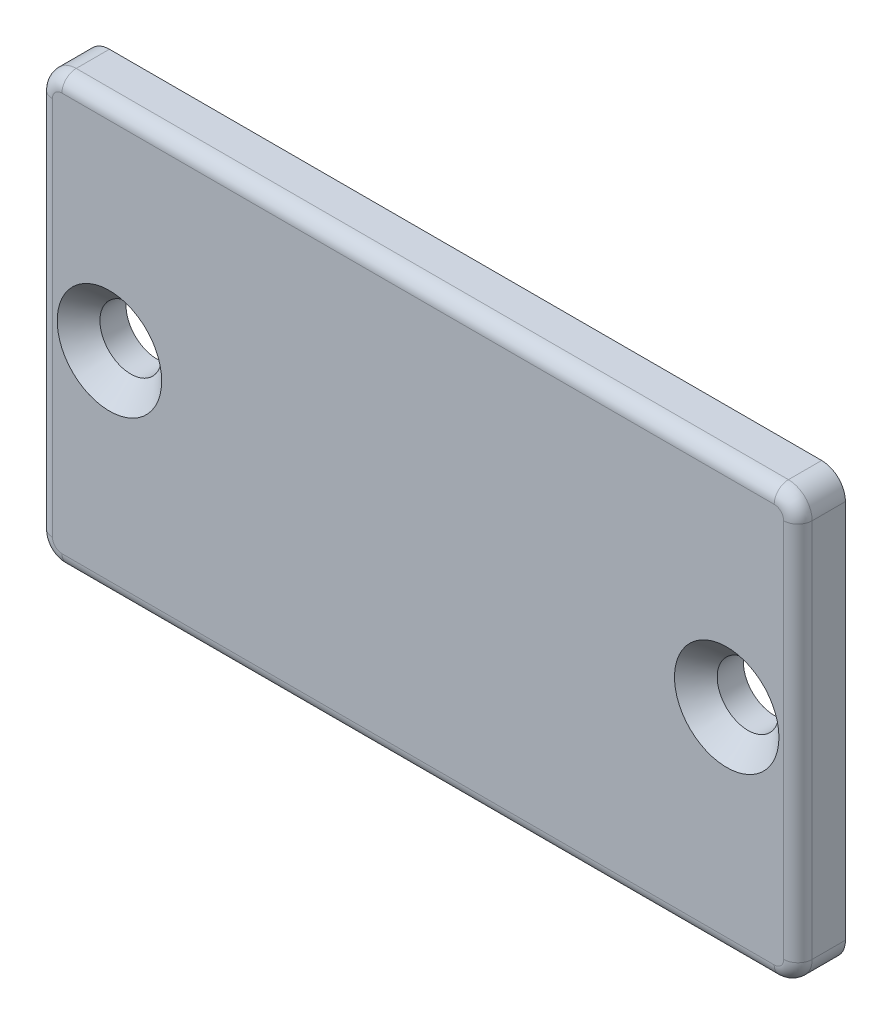
ISO-10303-21;
HEADER;
FILE_DESCRIPTION(('STEP AP214'),'2;1');
FILE_NAME('part.step','',(''),(''),'','','');
FILE_SCHEMA(('AUTOMOTIVE_DESIGN { 1 0 10303 214 1 1 1 1 }'));
ENDSEC;
DATA;
#1=APPLICATION_CONTEXT('core data for automotive mechanical design processes');
#2=APPLICATION_PROTOCOL_DEFINITION('international standard','automotive_design',2000,#1);
#3=PRODUCT_CONTEXT('',#1,'mechanical');
#4=PRODUCT('Part','Part','',(#3));
#5=PRODUCT_RELATED_PRODUCT_CATEGORY('part','',(#4));
#6=PRODUCT_DEFINITION_FORMATION('','',#4);
#7=PRODUCT_DEFINITION_CONTEXT('part definition',#1,'design');
#8=PRODUCT_DEFINITION('design','',#6,#7);
#9=PRODUCT_DEFINITION_SHAPE('','',#8);
#10=(LENGTH_UNIT() NAMED_UNIT(*) SI_UNIT(.MILLI.,.METRE.));
#11=(NAMED_UNIT(*) PLANE_ANGLE_UNIT() SI_UNIT($,.RADIAN.));
#12=(NAMED_UNIT(*) SI_UNIT($,.STERADIAN.) SOLID_ANGLE_UNIT());
#13=UNCERTAINTY_MEASURE_WITH_UNIT(LENGTH_MEASURE(1.E-05),#10,'distance_accuracy_value','');
#14=(GEOMETRIC_REPRESENTATION_CONTEXT(3) GLOBAL_UNCERTAINTY_ASSIGNED_CONTEXT((#13)) GLOBAL_UNIT_ASSIGNED_CONTEXT((#10,
#11,#12)) REPRESENTATION_CONTEXT('',''));
#15=CARTESIAN_POINT('',(0.,0.,0.));
#16=DIRECTION('',(0.,0.,1.));
#17=DIRECTION('',(1.,0.,0.));
#18=AXIS2_PLACEMENT_3D('',#15,#16,#17);
#19=CARTESIAN_POINT('',(16.,-9.,2.));
#20=DIRECTION('',(-1.,0.,0.));
#21=DIRECTION('',(0.,0.,1.));
#22=AXIS2_PLACEMENT_3D('',#19,#20,#21);
#23=PLANE('',#22);
#24=DIRECTION('',(0.,0.,-1.));
#25=VECTOR('',#24,1.);
#26=CARTESIAN_POINT('',(16.,8.,2.));
#27=LINE('',#26,#25);
#28=CARTESIAN_POINT('',(16.,8.,0.));
#29=VERTEX_POINT('',#28);
#30=CARTESIAN_POINT('',(16.,8.,1.4));
#31=VERTEX_POINT('',#30);
#32=EDGE_CURVE('E190',#29,#31,#27,.F.);
#33=ORIENTED_EDGE('',*,*,#32,.T.);
#34=DIRECTION('',(0.,1.,0.));
#35=VECTOR('',#34,1.);
#36=CARTESIAN_POINT('',(16.,-9.,1.4));
#37=LINE('',#36,#35);
#38=CARTESIAN_POINT('',(16.,-8.,1.4));
#39=VERTEX_POINT('',#38);
#40=EDGE_CURVE('E186',#31,#39,#37,.F.);
#41=ORIENTED_EDGE('',*,*,#40,.T.);
#42=DIRECTION('',(0.,0.,-1.));
#43=VECTOR('',#42,1.);
#44=CARTESIAN_POINT('',(16.,-8.,2.));
#45=LINE('',#44,#43);
#46=CARTESIAN_POINT('',(16.,-8.,0.));
#47=VERTEX_POINT('',#46);
#48=EDGE_CURVE('E179',#39,#47,#45,.T.);
#49=ORIENTED_EDGE('',*,*,#48,.T.);
#50=DIRECTION('',(0.,1.,0.));
#51=VECTOR('',#50,1.);
#52=CARTESIAN_POINT('',(16.,-9.,0.));
#53=LINE('',#52,#51);
#54=EDGE_CURVE('E183',#47,#29,#53,.T.);
#55=ORIENTED_EDGE('',*,*,#54,.T.);
#56=EDGE_LOOP('',(#33,#41,#49,#55));
#57=FACE_BOUND('',#56,.T.);
#58=ADVANCED_FACE('F41',(#57),#23,.F.);
#59=CARTESIAN_POINT('',(-16.,9.,2.));
#60=DIRECTION('',(0.,-1.,0.));
#61=DIRECTION('',(0.,0.,-1.));
#62=AXIS2_PLACEMENT_3D('',#59,#60,#61);
#63=PLANE('',#62);
#64=DIRECTION('',(0.,0.,-1.));
#65=VECTOR('',#64,1.);
#66=CARTESIAN_POINT('',(-15.,9.,2.));
#67=LINE('',#66,#65);
#68=CARTESIAN_POINT('',(-15.,9.,0.));
#69=VERTEX_POINT('',#68);
#70=CARTESIAN_POINT('',(-15.,9.,1.4));
#71=VERTEX_POINT('',#70);
#72=EDGE_CURVE('E237',#69,#71,#67,.F.);
#73=ORIENTED_EDGE('',*,*,#72,.T.);
#74=DIRECTION('',(-1.,0.,0.));
#75=VECTOR('',#74,1.);
#76=CARTESIAN_POINT('',(-16.,9.,1.4));
#77=LINE('',#76,#75);
#78=CARTESIAN_POINT('',(15.,9.,1.4));
#79=VERTEX_POINT('',#78);
#80=EDGE_CURVE('E264',#71,#79,#77,.F.);
#81=ORIENTED_EDGE('',*,*,#80,.T.);
#82=DIRECTION('',(0.,0.,-1.));
#83=VECTOR('',#82,1.);
#84=CARTESIAN_POINT('',(15.,9.,2.));
#85=LINE('',#84,#83);
#86=CARTESIAN_POINT('',(15.,9.,0.));
#87=VERTEX_POINT('',#86);
#88=EDGE_CURVE('E235',#79,#87,#85,.T.);
#89=ORIENTED_EDGE('',*,*,#88,.T.);
#90=DIRECTION('',(-1.,0.,0.));
#91=VECTOR('',#90,1.);
#92=CARTESIAN_POINT('',(-16.,9.,0.));
#93=LINE('',#92,#91);
#94=EDGE_CURVE('E206',#87,#69,#93,.T.);
#95=ORIENTED_EDGE('',*,*,#94,.T.);
#96=EDGE_LOOP('',(#73,#81,#89,#95));
#97=FACE_BOUND('',#96,.T.);
#98=ADVANCED_FACE('F404',(#97),#63,.F.);
#99=CARTESIAN_POINT('',(-16.,-9.,2.));
#100=DIRECTION('',(1.,0.,0.));
#101=DIRECTION('',(0.,0.,-1.));
#102=AXIS2_PLACEMENT_3D('',#99,#100,#101);
#103=PLANE('',#102);
#104=DIRECTION('',(0.,0.,-1.));
#105=VECTOR('',#104,1.);
#106=CARTESIAN_POINT('',(-16.,-8.,2.));
#107=LINE('',#106,#105);
#108=CARTESIAN_POINT('',(-16.,-8.,0.));
#109=VERTEX_POINT('',#108);
#110=CARTESIAN_POINT('',(-16.,-8.,1.4));
#111=VERTEX_POINT('',#110);
#112=EDGE_CURVE('E232',#109,#111,#107,.F.);
#113=ORIENTED_EDGE('',*,*,#112,.T.);
#114=DIRECTION('',(0.,-1.,0.));
#115=VECTOR('',#114,1.);
#116=CARTESIAN_POINT('',(-16.,-9.,1.4));
#117=LINE('',#116,#115);
#118=CARTESIAN_POINT('',(-16.,8.,1.4));
#119=VERTEX_POINT('',#118);
#120=EDGE_CURVE('E260',#111,#119,#117,.F.);
#121=ORIENTED_EDGE('',*,*,#120,.T.);
#122=DIRECTION('',(0.,0.,-1.));
#123=VECTOR('',#122,1.);
#124=CARTESIAN_POINT('',(-16.,8.,2.));
#125=LINE('',#124,#123);
#126=CARTESIAN_POINT('',(-16.,8.,0.));
#127=VERTEX_POINT('',#126);
#128=EDGE_CURVE('E230',#119,#127,#125,.T.);
#129=ORIENTED_EDGE('',*,*,#128,.T.);
#130=DIRECTION('',(0.,-1.,0.));
#131=VECTOR('',#130,1.);
#132=CARTESIAN_POINT('',(-16.,-9.,0.));
#133=LINE('',#132,#131);
#134=EDGE_CURVE('E210',#127,#109,#133,.T.);
#135=ORIENTED_EDGE('',*,*,#134,.T.);
#136=EDGE_LOOP('',(#113,#121,#129,#135));
#137=FACE_BOUND('',#136,.T.);
#138=ADVANCED_FACE('F409',(#137),#103,.F.);
#139=CARTESIAN_POINT('',(-16.,-9.,2.));
#140=DIRECTION('',(0.,1.,0.));
#141=DIRECTION('',(0.,0.,1.));
#142=AXIS2_PLACEMENT_3D('',#139,#140,#141);
#143=PLANE('',#142);
#144=DIRECTION('',(0.,0.,-1.));
#145=VECTOR('',#144,1.);
#146=CARTESIAN_POINT('',(15.,-9.,2.));
#147=LINE('',#146,#145);
#148=CARTESIAN_POINT('',(15.,-9.,0.));
#149=VERTEX_POINT('',#148);
#150=CARTESIAN_POINT('',(15.,-9.,1.4));
#151=VERTEX_POINT('',#150);
#152=EDGE_CURVE('E196',#149,#151,#147,.F.);
#153=ORIENTED_EDGE('',*,*,#152,.T.);
#154=DIRECTION('',(1.,0.,0.));
#155=VECTOR('',#154,1.);
#156=CARTESIAN_POINT('',(-16.,-9.,1.4));
#157=LINE('',#156,#155);
#158=CARTESIAN_POINT('',(-15.,-9.,1.4));
#159=VERTEX_POINT('',#158);
#160=EDGE_CURVE('E271',#151,#159,#157,.F.);
#161=ORIENTED_EDGE('',*,*,#160,.T.);
#162=DIRECTION('',(0.,0.,-1.));
#163=VECTOR('',#162,1.);
#164=CARTESIAN_POINT('',(-15.,-9.,2.));
#165=LINE('',#164,#163);
#166=CARTESIAN_POINT('',(-15.,-9.,0.));
#167=VERTEX_POINT('',#166);
#168=EDGE_CURVE('E200',#159,#167,#165,.T.);
#169=ORIENTED_EDGE('',*,*,#168,.T.);
#170=DIRECTION('',(1.,0.,0.));
#171=VECTOR('',#170,1.);
#172=CARTESIAN_POINT('',(-16.,-9.,0.));
#173=LINE('',#172,#171);
#174=EDGE_CURVE('E221',#167,#149,#173,.T.);
#175=ORIENTED_EDGE('',*,*,#174,.T.);
#176=EDGE_LOOP('',(#153,#161,#169,#175));
#177=FACE_BOUND('',#176,.T.);
#178=ADVANCED_FACE('F397',(#177),#143,.F.);
#179=CARTESIAN_POINT('',(0.,0.,2.));
#180=DIRECTION('',(0.,0.,-1.));
#181=DIRECTION('',(-1.,0.,0.));
#182=AXIS2_PLACEMENT_3D('',#179,#180,#181);
#183=PLANE('',#182);
#184=CARTESIAN_POINT('',(13.,0.,2.));
#185=DIRECTION('',(0.,0.,1.));
#186=DIRECTION('',(1.,0.,0.));
#187=AXIS2_PLACEMENT_3D('',#184,#185,#186);
#188=CIRCLE('',#187,2.2);
#189=CARTESIAN_POINT('',(15.2,0.,2.));
#190=VERTEX_POINT('',#189);
#191=EDGE_CURVE('E564',#190,#190,#188,.T.);
#192=ORIENTED_EDGE('',*,*,#191,.F.);
#193=EDGE_LOOP('',(#192));
#194=FACE_BOUND('',#193,.T.);
#195=CARTESIAN_POINT('',(-13.,0.,2.));
#196=DIRECTION('',(0.,0.,1.));
#197=DIRECTION('',(1.,0.,0.));
#198=AXIS2_PLACEMENT_3D('',#195,#196,#197);
#199=CIRCLE('',#198,2.2);
#200=CARTESIAN_POINT('',(-10.8,0.,2.));
#201=VERTEX_POINT('',#200);
#202=EDGE_CURVE('E333',#201,#201,#199,.T.);
#203=ORIENTED_EDGE('',*,*,#202,.F.);
#204=EDGE_LOOP('',(#203));
#205=FACE_BOUND('',#204,.T.);
#206=DIRECTION('',(0.,-1.,0.));
#207=VECTOR('',#206,1.);
#208=CARTESIAN_POINT('',(-15.4,0.,2.));
#209=LINE('',#208,#207);
#210=CARTESIAN_POINT('',(-15.4,8.,2.));
#211=VERTEX_POINT('',#210);
#212=CARTESIAN_POINT('',(-15.4,-8.,2.));
#213=VERTEX_POINT('',#212);
#214=EDGE_CURVE('E252',#211,#213,#209,.T.);
#215=ORIENTED_EDGE('',*,*,#214,.T.);
#216=CARTESIAN_POINT('',(-15.,-8.,2.));
#217=DIRECTION('',(0.,0.,-1.));
#218=DIRECTION('',(-1.,0.,0.));
#219=AXIS2_PLACEMENT_3D('',#216,#217,#218);
#220=CIRCLE('',#219,0.4);
#221=CARTESIAN_POINT('',(-15.,-8.4,2.));
#222=VERTEX_POINT('',#221);
#223=EDGE_CURVE('E254',#213,#222,#220,.F.);
#224=ORIENTED_EDGE('',*,*,#223,.T.);
#225=DIRECTION('',(1.,0.,0.));
#226=VECTOR('',#225,1.);
#227=CARTESIAN_POINT('',(0.,-8.4,2.));
#228=LINE('',#227,#226);
#229=CARTESIAN_POINT('',(15.,-8.4,2.));
#230=VERTEX_POINT('',#229);
#231=EDGE_CURVE('E240',#222,#230,#228,.T.);
#232=ORIENTED_EDGE('',*,*,#231,.T.);
#233=CARTESIAN_POINT('',(15.,-8.,2.));
#234=DIRECTION('',(0.,0.,-1.));
#235=DIRECTION('',(-1.,0.,0.));
#236=AXIS2_PLACEMENT_3D('',#233,#234,#235);
#237=CIRCLE('',#236,0.4);
#238=CARTESIAN_POINT('',(15.4,-8.,2.));
#239=VERTEX_POINT('',#238);
#240=EDGE_CURVE('E242',#230,#239,#237,.F.);
#241=ORIENTED_EDGE('',*,*,#240,.T.);
#242=DIRECTION('',(0.,1.,0.));
#243=VECTOR('',#242,1.);
#244=CARTESIAN_POINT('',(15.4,0.,2.));
#245=LINE('',#244,#243);
#246=CARTESIAN_POINT('',(15.4,8.,2.));
#247=VERTEX_POINT('',#246);
#248=EDGE_CURVE('E244',#239,#247,#245,.T.);
#249=ORIENTED_EDGE('',*,*,#248,.T.);
#250=CARTESIAN_POINT('',(15.,8.,2.));
#251=DIRECTION('',(0.,0.,-1.));
#252=DIRECTION('',(-1.,0.,0.));
#253=AXIS2_PLACEMENT_3D('',#250,#251,#252);
#254=CIRCLE('',#253,0.4);
#255=CARTESIAN_POINT('',(15.,8.4,2.));
#256=VERTEX_POINT('',#255);
#257=EDGE_CURVE('E246',#247,#256,#254,.F.);
#258=ORIENTED_EDGE('',*,*,#257,.T.);
#259=DIRECTION('',(-1.,0.,0.));
#260=VECTOR('',#259,1.);
#261=CARTESIAN_POINT('',(0.,8.4,2.));
#262=LINE('',#261,#260);
#263=CARTESIAN_POINT('',(-15.,8.4,2.));
#264=VERTEX_POINT('',#263);
#265=EDGE_CURVE('E248',#256,#264,#262,.T.);
#266=ORIENTED_EDGE('',*,*,#265,.T.);
#267=CARTESIAN_POINT('',(-15.,8.,2.));
#268=DIRECTION('',(0.,0.,-1.));
#269=DIRECTION('',(-1.,0.,0.));
#270=AXIS2_PLACEMENT_3D('',#267,#268,#269);
#271=CIRCLE('',#270,0.4);
#272=EDGE_CURVE('E250',#264,#211,#271,.F.);
#273=ORIENTED_EDGE('',*,*,#272,.T.);
#274=EDGE_LOOP('',(#215,#224,#232,#241,#249,#258,#266,#273));
#275=FACE_BOUND('',#274,.T.);
#276=ADVANCED_FACE('F388',(#194,#205,#275),#183,.F.);
#277=CARTESIAN_POINT('',(0.,0.,0.));
#278=DIRECTION('',(0.,0.,-1.));
#279=DIRECTION('',(-1.,0.,0.));
#280=AXIS2_PLACEMENT_3D('',#277,#278,#279);
#281=PLANE('',#280);
#282=CARTESIAN_POINT('',(13.,0.,0.));
#283=DIRECTION('',(0.,0.,-1.));
#284=DIRECTION('',(-1.,0.,0.));
#285=AXIS2_PLACEMENT_3D('',#282,#283,#284);
#286=CIRCLE('',#285,1.3);
#287=CARTESIAN_POINT('',(11.7,0.,0.));
#288=VERTEX_POINT('',#287);
#289=EDGE_CURVE('E45',#288,#288,#286,.T.);
#290=ORIENTED_EDGE('',*,*,#289,.F.);
#291=EDGE_LOOP('',(#290));
#292=FACE_BOUND('',#291,.T.);
#293=CARTESIAN_POINT('',(-13.,0.,0.));
#294=DIRECTION('',(0.,0.,-1.));
#295=DIRECTION('',(-1.,0.,0.));
#296=AXIS2_PLACEMENT_3D('',#293,#294,#295);
#297=CIRCLE('',#296,1.3);
#298=CARTESIAN_POINT('',(-14.3,0.,0.));
#299=VERTEX_POINT('',#298);
#300=EDGE_CURVE('E277',#299,#299,#297,.T.);
#301=ORIENTED_EDGE('',*,*,#300,.F.);
#302=EDGE_LOOP('',(#301));
#303=FACE_BOUND('',#302,.T.);
#304=DIRECTION('',(0.,1.,0.));
#305=VECTOR('',#304,1.);
#306=CARTESIAN_POINT('',(-9.5,-6.,0.));
#307=LINE('',#306,#305);
#308=CARTESIAN_POINT('',(-9.5,-5.,0.));
#309=VERTEX_POINT('',#308);
#310=CARTESIAN_POINT('',(-9.5,5.,0.));
#311=VERTEX_POINT('',#310);
#312=EDGE_CURVE('E297',#309,#311,#307,.T.);
#313=ORIENTED_EDGE('',*,*,#312,.F.);
#314=CARTESIAN_POINT('',(-8.5,-5.,0.));
#315=DIRECTION('',(0.,0.,-1.));
#316=DIRECTION('',(-1.,0.,0.));
#317=AXIS2_PLACEMENT_3D('',#314,#315,#316);
#318=CIRCLE('',#317,1.);
#319=CARTESIAN_POINT('',(-8.5,-6.,0.));
#320=VERTEX_POINT('',#319);
#321=EDGE_CURVE('E326',#309,#320,#318,.F.);
#322=ORIENTED_EDGE('',*,*,#321,.T.);
#323=DIRECTION('',(-1.,0.,0.));
#324=VECTOR('',#323,1.);
#325=CARTESIAN_POINT('',(9.5,-6.,0.));
#326=LINE('',#325,#324);
#327=CARTESIAN_POINT('',(8.5,-6.,0.));
#328=VERTEX_POINT('',#327);
#329=EDGE_CURVE('E216',#328,#320,#326,.T.);
#330=ORIENTED_EDGE('',*,*,#329,.F.);
#331=CARTESIAN_POINT('',(8.5,-5.,0.));
#332=DIRECTION('',(0.,0.,-1.));
#333=DIRECTION('',(-1.,0.,0.));
#334=AXIS2_PLACEMENT_3D('',#331,#332,#333);
#335=CIRCLE('',#334,1.);
#336=CARTESIAN_POINT('',(9.5,-5.,0.));
#337=VERTEX_POINT('',#336);
#338=EDGE_CURVE('E324',#328,#337,#335,.F.);
#339=ORIENTED_EDGE('',*,*,#338,.T.);
#340=DIRECTION('',(0.,-1.,0.));
#341=VECTOR('',#340,1.);
#342=CARTESIAN_POINT('',(9.5,-6.,0.));
#343=LINE('',#342,#341);
#344=CARTESIAN_POINT('',(9.5,5.,0.));
#345=VERTEX_POINT('',#344);
#346=EDGE_CURVE('E352',#345,#337,#343,.T.);
#347=ORIENTED_EDGE('',*,*,#346,.F.);
#348=CARTESIAN_POINT('',(8.5,5.,0.));
#349=DIRECTION('',(0.,0.,-1.));
#350=DIRECTION('',(-1.,0.,0.));
#351=AXIS2_PLACEMENT_3D('',#348,#349,#350);
#352=CIRCLE('',#351,1.);
#353=CARTESIAN_POINT('',(8.5,6.,0.));
#354=VERTEX_POINT('',#353);
#355=EDGE_CURVE('E11',#345,#354,#352,.F.);
#356=ORIENTED_EDGE('',*,*,#355,.T.);
#357=DIRECTION('',(1.,0.,0.));
#358=VECTOR('',#357,1.);
#359=CARTESIAN_POINT('',(9.5,6.,0.));
#360=LINE('',#359,#358);
#361=CARTESIAN_POINT('',(-8.5,6.,0.));
#362=VERTEX_POINT('',#361);
#363=EDGE_CURVE('E351',#362,#354,#360,.T.);
#364=ORIENTED_EDGE('',*,*,#363,.F.);
#365=CARTESIAN_POINT('',(-8.5,5.,0.));
#366=DIRECTION('',(0.,0.,-1.));
#367=DIRECTION('',(-1.,0.,0.));
#368=AXIS2_PLACEMENT_3D('',#365,#366,#367);
#369=CIRCLE('',#368,1.);
#370=EDGE_CURVE('E50',#362,#311,#369,.F.);
#371=ORIENTED_EDGE('',*,*,#370,.T.);
#372=EDGE_LOOP('',(#313,#322,#330,#339,#347,#356,#364,#371));
#373=FACE_BOUND('',#372,.T.);
#374=ORIENTED_EDGE('',*,*,#54,.F.);
#375=CARTESIAN_POINT('',(15.,-8.,0.));
#376=DIRECTION('',(0.,0.,-1.));
#377=DIRECTION('',(-1.,0.,0.));
#378=AXIS2_PLACEMENT_3D('',#375,#376,#377);
#379=CIRCLE('',#378,1.);
#380=EDGE_CURVE('E193',#47,#149,#379,.T.);
#381=ORIENTED_EDGE('',*,*,#380,.T.);
#382=ORIENTED_EDGE('',*,*,#174,.F.);
#383=CARTESIAN_POINT('',(-15.,-8.,0.));
#384=DIRECTION('',(0.,0.,-1.));
#385=DIRECTION('',(-1.,0.,0.));
#386=AXIS2_PLACEMENT_3D('',#383,#384,#385);
#387=CIRCLE('',#386,1.);
#388=EDGE_CURVE('E201',#167,#109,#387,.T.);
#389=ORIENTED_EDGE('',*,*,#388,.T.);
#390=ORIENTED_EDGE('',*,*,#134,.F.);
#391=CARTESIAN_POINT('',(-15.,8.,0.));
#392=DIRECTION('',(0.,0.,-1.));
#393=DIRECTION('',(-1.,0.,0.));
#394=AXIS2_PLACEMENT_3D('',#391,#392,#393);
#395=CIRCLE('',#394,1.);
#396=EDGE_CURVE('E225',#127,#69,#395,.T.);
#397=ORIENTED_EDGE('',*,*,#396,.T.);
#398=ORIENTED_EDGE('',*,*,#94,.F.);
#399=CARTESIAN_POINT('',(15.,8.,0.));
#400=DIRECTION('',(0.,0.,-1.));
#401=DIRECTION('',(-1.,0.,0.));
#402=AXIS2_PLACEMENT_3D('',#399,#400,#401);
#403=CIRCLE('',#402,1.);
#404=EDGE_CURVE('E189',#87,#29,#403,.T.);
#405=ORIENTED_EDGE('',*,*,#404,.T.);
#406=EDGE_LOOP('',(#374,#381,#382,#389,#390,#397,#398,#405));
#407=FACE_BOUND('',#406,.T.);
#408=ADVANCED_FACE('F203',(#292,#303,#373,#407),#281,.T.);
#409=CARTESIAN_POINT('',(-9.5,-6.,-1.4));
#410=DIRECTION('',(1.,0.,0.));
#411=DIRECTION('',(0.,0.,-1.));
#412=AXIS2_PLACEMENT_3D('',#409,#410,#411);
#413=PLANE('',#412);
#414=DIRECTION('',(0.,1.,0.));
#415=VECTOR('',#414,1.);
#416=CARTESIAN_POINT('',(-9.5,-6.,-1.4));
#417=LINE('',#416,#415);
#418=CARTESIAN_POINT('',(-9.5,-5.,-1.4));
#419=VERTEX_POINT('',#418);
#420=CARTESIAN_POINT('',(-9.5,5.,-1.4));
#421=VERTEX_POINT('',#420);
#422=EDGE_CURVE('E341',#419,#421,#417,.T.);
#423=ORIENTED_EDGE('',*,*,#422,.F.);
#424=DIRECTION('',(0.,0.,1.));
#425=VECTOR('',#424,1.);
#426=CARTESIAN_POINT('',(-9.5,-5.,-1.4));
#427=LINE('',#426,#425);
#428=EDGE_CURVE('E317',#419,#309,#427,.T.);
#429=ORIENTED_EDGE('',*,*,#428,.T.);
#430=ORIENTED_EDGE('',*,*,#312,.T.);
#431=DIRECTION('',(0.,0.,1.));
#432=VECTOR('',#431,1.);
#433=CARTESIAN_POINT('',(-9.5,5.,-1.4));
#434=LINE('',#433,#432);
#435=EDGE_CURVE('E315',#311,#421,#434,.F.);
#436=ORIENTED_EDGE('',*,*,#435,.T.);
#437=EDGE_LOOP('',(#423,#429,#430,#436));
#438=FACE_BOUND('',#437,.T.);
#439=ADVANCED_FACE('F372',(#438),#413,.F.);
#440=CARTESIAN_POINT('',(9.5,6.,-1.4));
#441=DIRECTION('',(0.,-1.,0.));
#442=DIRECTION('',(0.,0.,-1.));
#443=AXIS2_PLACEMENT_3D('',#440,#441,#442);
#444=PLANE('',#443);
#445=DIRECTION('',(1.,0.,0.));
#446=VECTOR('',#445,1.);
#447=CARTESIAN_POINT('',(9.5,6.,-1.4));
#448=LINE('',#447,#446);
#449=CARTESIAN_POINT('',(-8.5,6.,-1.4));
#450=VERTEX_POINT('',#449);
#451=CARTESIAN_POINT('',(8.5,6.,-1.4));
#452=VERTEX_POINT('',#451);
#453=EDGE_CURVE('E344',#450,#452,#448,.T.);
#454=ORIENTED_EDGE('',*,*,#453,.F.);
#455=DIRECTION('',(0.,0.,1.));
#456=VECTOR('',#455,1.);
#457=CARTESIAN_POINT('',(-8.5,6.,-1.4));
#458=LINE('',#457,#456);
#459=EDGE_CURVE('E322',#450,#362,#458,.T.);
#460=ORIENTED_EDGE('',*,*,#459,.T.);
#461=ORIENTED_EDGE('',*,*,#363,.T.);
#462=DIRECTION('',(0.,0.,1.));
#463=VECTOR('',#462,1.);
#464=CARTESIAN_POINT('',(8.5,6.,-1.4));
#465=LINE('',#464,#463);
#466=EDGE_CURVE('E320',#354,#452,#465,.F.);
#467=ORIENTED_EDGE('',*,*,#466,.T.);
#468=EDGE_LOOP('',(#454,#460,#461,#467));
#469=FACE_BOUND('',#468,.T.);
#470=ADVANCED_FACE('F378',(#469),#444,.F.);
#471=CARTESIAN_POINT('',(9.5,-6.,-1.4));
#472=DIRECTION('',(-1.,0.,0.));
#473=DIRECTION('',(0.,0.,1.));
#474=AXIS2_PLACEMENT_3D('',#471,#472,#473);
#475=PLANE('',#474);
#476=ORIENTED_EDGE('',*,*,#346,.T.);
#477=DIRECTION('',(0.,0.,1.));
#478=VECTOR('',#477,1.);
#479=CARTESIAN_POINT('',(9.5,-5.,-1.4));
#480=LINE('',#479,#478);
#481=CARTESIAN_POINT('',(9.5,-5.,-1.4));
#482=VERTEX_POINT('',#481);
#483=EDGE_CURVE('E305',#337,#482,#480,.F.);
#484=ORIENTED_EDGE('',*,*,#483,.T.);
#485=DIRECTION('',(0.,-1.,0.));
#486=VECTOR('',#485,1.);
#487=CARTESIAN_POINT('',(9.5,-6.,-1.4));
#488=LINE('',#487,#486);
#489=CARTESIAN_POINT('',(9.5,5.,-1.4));
#490=VERTEX_POINT('',#489);
#491=EDGE_CURVE('E213',#490,#482,#488,.T.);
#492=ORIENTED_EDGE('',*,*,#491,.F.);
#493=DIRECTION('',(0.,0.,1.));
#494=VECTOR('',#493,1.);
#495=CARTESIAN_POINT('',(9.5,5.,-1.4));
#496=LINE('',#495,#494);
#497=EDGE_CURVE('E302',#490,#345,#496,.T.);
#498=ORIENTED_EDGE('',*,*,#497,.T.);
#499=EDGE_LOOP('',(#476,#484,#492,#498));
#500=FACE_BOUND('',#499,.T.);
#501=ADVANCED_FACE('F384',(#500),#475,.F.);
#502=CARTESIAN_POINT('',(9.5,-6.,-1.4));
#503=DIRECTION('',(0.,1.,0.));
#504=DIRECTION('',(0.,0.,1.));
#505=AXIS2_PLACEMENT_3D('',#502,#503,#504);
#506=PLANE('',#505);
#507=DIRECTION('',(-1.,0.,0.));
#508=VECTOR('',#507,1.);
#509=CARTESIAN_POINT('',(9.5,-6.,-1.4));
#510=LINE('',#509,#508);
#511=CARTESIAN_POINT('',(8.5,-6.,-1.4));
#512=VERTEX_POINT('',#511);
#513=CARTESIAN_POINT('',(-8.5,-6.,-1.4));
#514=VERTEX_POINT('',#513);
#515=EDGE_CURVE('E207',#512,#514,#510,.T.);
#516=ORIENTED_EDGE('',*,*,#515,.F.);
#517=DIRECTION('',(0.,0.,1.));
#518=VECTOR('',#517,1.);
#519=CARTESIAN_POINT('',(8.5,-6.,-1.4));
#520=LINE('',#519,#518);
#521=EDGE_CURVE('E299',#512,#328,#520,.T.);
#522=ORIENTED_EDGE('',*,*,#521,.T.);
#523=ORIENTED_EDGE('',*,*,#329,.T.);
#524=DIRECTION('',(0.,0.,1.));
#525=VECTOR('',#524,1.);
#526=CARTESIAN_POINT('',(-8.5,-6.,-1.4));
#527=LINE('',#526,#525);
#528=EDGE_CURVE('E273',#320,#514,#527,.F.);
#529=ORIENTED_EDGE('',*,*,#528,.T.);
#530=EDGE_LOOP('',(#516,#522,#523,#529));
#531=FACE_BOUND('',#530,.T.);
#532=ADVANCED_FACE('F361',(#531),#506,.F.);
#533=CARTESIAN_POINT('',(0.,0.,-1.4));
#534=DIRECTION('',(0.,0.,1.));
#535=DIRECTION('',(1.,0.,0.));
#536=AXIS2_PLACEMENT_3D('',#533,#534,#535);
#537=PLANE('',#536);
#538=ORIENTED_EDGE('',*,*,#491,.T.);
#539=CARTESIAN_POINT('',(8.5,-5.,-1.4));
#540=DIRECTION('',(0.,0.,1.));
#541=DIRECTION('',(1.,0.,0.));
#542=AXIS2_PLACEMENT_3D('',#539,#540,#541);
#543=CIRCLE('',#542,1.);
#544=EDGE_CURVE('E313',#482,#512,#543,.F.);
#545=ORIENTED_EDGE('',*,*,#544,.T.);
#546=ORIENTED_EDGE('',*,*,#515,.T.);
#547=CARTESIAN_POINT('',(-8.5,-5.,-1.4));
#548=DIRECTION('',(0.,0.,1.));
#549=DIRECTION('',(1.,0.,0.));
#550=AXIS2_PLACEMENT_3D('',#547,#548,#549);
#551=CIRCLE('',#550,1.);
#552=EDGE_CURVE('E311',#514,#419,#551,.F.);
#553=ORIENTED_EDGE('',*,*,#552,.T.);
#554=ORIENTED_EDGE('',*,*,#422,.T.);
#555=CARTESIAN_POINT('',(-8.5,5.,-1.4));
#556=DIRECTION('',(0.,0.,1.));
#557=DIRECTION('',(1.,0.,0.));
#558=AXIS2_PLACEMENT_3D('',#555,#556,#557);
#559=CIRCLE('',#558,1.);
#560=EDGE_CURVE('E309',#421,#450,#559,.F.);
#561=ORIENTED_EDGE('',*,*,#560,.T.);
#562=ORIENTED_EDGE('',*,*,#453,.T.);
#563=CARTESIAN_POINT('',(8.5,5.,-1.4));
#564=DIRECTION('',(0.,0.,1.));
#565=DIRECTION('',(1.,0.,0.));
#566=AXIS2_PLACEMENT_3D('',#563,#564,#565);
#567=CIRCLE('',#566,1.);
#568=EDGE_CURVE('E307',#452,#490,#567,.F.);
#569=ORIENTED_EDGE('',*,*,#568,.T.);
#570=EDGE_LOOP('',(#538,#545,#546,#553,#554,#561,#562,#569));
#571=FACE_BOUND('',#570,.T.);
#572=ADVANCED_FACE('F369',(#571),#537,.F.);
#573=CARTESIAN_POINT('',(15.,-8.,2.));
#574=DIRECTION('',(0.,0.,-1.));
#575=DIRECTION('',(-1.,0.,0.));
#576=AXIS2_PLACEMENT_3D('',#573,#574,#575);
#577=CYLINDRICAL_SURFACE('',#576,1.);
#578=ORIENTED_EDGE('',*,*,#48,.F.);
#579=CARTESIAN_POINT('',(15.,-8.,1.4));
#580=DIRECTION('',(0.,0.,-1.));
#581=DIRECTION('',(-1.,0.,0.));
#582=AXIS2_PLACEMENT_3D('',#579,#580,#581);
#583=CIRCLE('',#582,1.);
#584=EDGE_CURVE('E269',#39,#151,#583,.T.);
#585=ORIENTED_EDGE('',*,*,#584,.T.);
#586=ORIENTED_EDGE('',*,*,#152,.F.);
#587=ORIENTED_EDGE('',*,*,#380,.F.);
#588=EDGE_LOOP('',(#578,#585,#586,#587));
#589=FACE_BOUND('',#588,.T.);
#590=ADVANCED_FACE('F194',(#589),#577,.T.);
#591=CARTESIAN_POINT('',(-15.,-8.,2.));
#592=DIRECTION('',(0.,0.,-1.));
#593=DIRECTION('',(-1.,0.,0.));
#594=AXIS2_PLACEMENT_3D('',#591,#592,#593);
#595=CYLINDRICAL_SURFACE('',#594,1.);
#596=ORIENTED_EDGE('',*,*,#168,.F.);
#597=CARTESIAN_POINT('',(-15.,-8.,1.4));
#598=DIRECTION('',(0.,0.,-1.));
#599=DIRECTION('',(-1.,0.,0.));
#600=AXIS2_PLACEMENT_3D('',#597,#598,#599);
#601=CIRCLE('',#600,1.);
#602=EDGE_CURVE('E257',#159,#111,#601,.T.);
#603=ORIENTED_EDGE('',*,*,#602,.T.);
#604=ORIENTED_EDGE('',*,*,#112,.F.);
#605=ORIENTED_EDGE('',*,*,#388,.F.);
#606=EDGE_LOOP('',(#596,#603,#604,#605));
#607=FACE_BOUND('',#606,.T.);
#608=ADVANCED_FACE('F416',(#607),#595,.T.);
#609=CARTESIAN_POINT('',(-15.,8.,2.));
#610=DIRECTION('',(0.,0.,-1.));
#611=DIRECTION('',(-1.,0.,0.));
#612=AXIS2_PLACEMENT_3D('',#609,#610,#611);
#613=CYLINDRICAL_SURFACE('',#612,1.);
#614=ORIENTED_EDGE('',*,*,#128,.F.);
#615=CARTESIAN_POINT('',(-15.,8.,1.4));
#616=DIRECTION('',(0.,0.,-1.));
#617=DIRECTION('',(-1.,0.,0.));
#618=AXIS2_PLACEMENT_3D('',#615,#616,#617);
#619=CIRCLE('',#618,1.);
#620=EDGE_CURVE('E262',#119,#71,#619,.T.);
#621=ORIENTED_EDGE('',*,*,#620,.T.);
#622=ORIENTED_EDGE('',*,*,#72,.F.);
#623=ORIENTED_EDGE('',*,*,#396,.F.);
#624=EDGE_LOOP('',(#614,#621,#622,#623));
#625=FACE_BOUND('',#624,.T.);
#626=ADVANCED_FACE('F419',(#625),#613,.T.);
#627=CARTESIAN_POINT('',(15.,8.,2.));
#628=DIRECTION('',(0.,0.,-1.));
#629=DIRECTION('',(-1.,0.,0.));
#630=AXIS2_PLACEMENT_3D('',#627,#628,#629);
#631=CYLINDRICAL_SURFACE('',#630,1.);
#632=ORIENTED_EDGE('',*,*,#88,.F.);
#633=CARTESIAN_POINT('',(15.,8.,1.4));
#634=DIRECTION('',(0.,0.,-1.));
#635=DIRECTION('',(-1.,0.,0.));
#636=AXIS2_PLACEMENT_3D('',#633,#634,#635);
#637=CIRCLE('',#636,1.);
#638=EDGE_CURVE('E266',#79,#31,#637,.T.);
#639=ORIENTED_EDGE('',*,*,#638,.T.);
#640=ORIENTED_EDGE('',*,*,#32,.F.);
#641=ORIENTED_EDGE('',*,*,#404,.F.);
#642=EDGE_LOOP('',(#632,#639,#640,#641));
#643=FACE_BOUND('',#642,.T.);
#644=ADVANCED_FACE('F423',(#643),#631,.T.);
#645=CARTESIAN_POINT('',(15.,8.,1.4));
#646=DIRECTION('',(0.,0.,-1.));
#647=DIRECTION('',(-1.,0.,0.));
#648=AXIS2_PLACEMENT_3D('',#645,#646,#647);
#649=DEGENERATE_TOROIDAL_SURFACE('',#648,0.4,0.6,.T.);
#650=CARTESIAN_POINT('',(15.4,8.,1.4));
#651=DIRECTION('',(0.,-1.,0.));
#652=DIRECTION('',(0.,0.,-1.));
#653=AXIS2_PLACEMENT_3D('',#650,#651,#652);
#654=CIRCLE('',#653,0.6);
#655=EDGE_CURVE('E291',#31,#247,#654,.T.);
#656=ORIENTED_EDGE('',*,*,#655,.F.);
#657=ORIENTED_EDGE('',*,*,#638,.F.);
#658=CARTESIAN_POINT('',(15.,8.4,1.4));
#659=DIRECTION('',(-1.,0.,0.));
#660=DIRECTION('',(0.,0.,1.));
#661=AXIS2_PLACEMENT_3D('',#658,#659,#660);
#662=CIRCLE('',#661,0.6);
#663=EDGE_CURVE('E294',#256,#79,#662,.T.);
#664=ORIENTED_EDGE('',*,*,#663,.F.);
#665=ORIENTED_EDGE('',*,*,#257,.F.);
#666=EDGE_LOOP('',(#656,#657,#664,#665));
#667=FACE_BOUND('',#666,.T.);
#668=ADVANCED_FACE('F427',(#667),#649,.T.);
#669=CARTESIAN_POINT('',(0.,8.4,1.4));
#670=DIRECTION('',(-1.,0.,0.));
#671=DIRECTION('',(0.,0.,1.));
#672=AXIS2_PLACEMENT_3D('',#669,#670,#671);
#673=CYLINDRICAL_SURFACE('',#672,0.6);
#674=ORIENTED_EDGE('',*,*,#663,.T.);
#675=ORIENTED_EDGE('',*,*,#80,.F.);
#676=CARTESIAN_POINT('',(-15.,8.4,1.4));
#677=DIRECTION('',(-1.,0.,0.));
#678=DIRECTION('',(0.,0.,1.));
#679=AXIS2_PLACEMENT_3D('',#676,#677,#678);
#680=CIRCLE('',#679,0.6);
#681=EDGE_CURVE('E288',#264,#71,#680,.T.);
#682=ORIENTED_EDGE('',*,*,#681,.F.);
#683=ORIENTED_EDGE('',*,*,#265,.F.);
#684=EDGE_LOOP('',(#674,#675,#682,#683));
#685=FACE_BOUND('',#684,.T.);
#686=ADVANCED_FACE('F452',(#685),#673,.T.);
#687=CARTESIAN_POINT('',(15.4,0.,1.4));
#688=DIRECTION('',(0.,1.,0.));
#689=DIRECTION('',(0.,0.,1.));
#690=AXIS2_PLACEMENT_3D('',#687,#688,#689);
#691=CYLINDRICAL_SURFACE('',#690,0.6);
#692=ORIENTED_EDGE('',*,*,#655,.T.);
#693=ORIENTED_EDGE('',*,*,#248,.F.);
#694=CARTESIAN_POINT('',(15.4,-8.,1.4));
#695=DIRECTION('',(0.,-1.,0.));
#696=DIRECTION('',(0.,0.,-1.));
#697=AXIS2_PLACEMENT_3D('',#694,#695,#696);
#698=CIRCLE('',#697,0.6);
#699=EDGE_CURVE('E285',#39,#239,#698,.T.);
#700=ORIENTED_EDGE('',*,*,#699,.F.);
#701=ORIENTED_EDGE('',*,*,#40,.F.);
#702=EDGE_LOOP('',(#692,#693,#700,#701));
#703=FACE_BOUND('',#702,.T.);
#704=ADVANCED_FACE('F448',(#703),#691,.T.);
#705=CARTESIAN_POINT('',(-15.,8.,1.4));
#706=DIRECTION('',(0.,0.,-1.));
#707=DIRECTION('',(-1.,0.,0.));
#708=AXIS2_PLACEMENT_3D('',#705,#706,#707);
#709=DEGENERATE_TOROIDAL_SURFACE('',#708,0.4,0.6,.T.);
#710=ORIENTED_EDGE('',*,*,#681,.T.);
#711=ORIENTED_EDGE('',*,*,#620,.F.);
#712=CARTESIAN_POINT('',(-15.4,8.,1.4));
#713=DIRECTION('',(0.,-1.,0.));
#714=DIRECTION('',(0.,0.,-1.));
#715=AXIS2_PLACEMENT_3D('',#712,#713,#714);
#716=CIRCLE('',#715,0.6);
#717=EDGE_CURVE('E282',#211,#119,#716,.T.);
#718=ORIENTED_EDGE('',*,*,#717,.F.);
#719=ORIENTED_EDGE('',*,*,#272,.F.);
#720=EDGE_LOOP('',(#710,#711,#718,#719));
#721=FACE_BOUND('',#720,.T.);
#722=ADVANCED_FACE('F444',(#721),#709,.T.);
#723=CARTESIAN_POINT('',(15.,-8.,1.4));
#724=DIRECTION('',(0.,0.,-1.));
#725=DIRECTION('',(-1.,0.,0.));
#726=AXIS2_PLACEMENT_3D('',#723,#724,#725);
#727=DEGENERATE_TOROIDAL_SURFACE('',#726,0.4,0.6,.T.);
#728=ORIENTED_EDGE('',*,*,#699,.T.);
#729=ORIENTED_EDGE('',*,*,#240,.F.);
#730=CARTESIAN_POINT('',(15.,-8.4,1.4));
#731=DIRECTION('',(-1.,0.,0.));
#732=DIRECTION('',(0.,0.,1.));
#733=AXIS2_PLACEMENT_3D('',#730,#731,#732);
#734=CIRCLE('',#733,0.6);
#735=EDGE_CURVE('E279',#151,#230,#734,.T.);
#736=ORIENTED_EDGE('',*,*,#735,.F.);
#737=ORIENTED_EDGE('',*,*,#584,.F.);
#738=EDGE_LOOP('',(#728,#729,#736,#737));
#739=FACE_BOUND('',#738,.T.);
#740=ADVANCED_FACE('F440',(#739),#727,.T.);
#741=CARTESIAN_POINT('',(-15.4,0.,1.4));
#742=DIRECTION('',(0.,-1.,0.));
#743=DIRECTION('',(0.,0.,-1.));
#744=AXIS2_PLACEMENT_3D('',#741,#742,#743);
#745=CYLINDRICAL_SURFACE('',#744,0.6);
#746=ORIENTED_EDGE('',*,*,#717,.T.);
#747=ORIENTED_EDGE('',*,*,#120,.F.);
#748=CARTESIAN_POINT('',(-15.4,-8.,1.4));
#749=DIRECTION('',(0.,-1.,0.));
#750=DIRECTION('',(0.,0.,-1.));
#751=AXIS2_PLACEMENT_3D('',#748,#749,#750);
#752=CIRCLE('',#751,0.6);
#753=EDGE_CURVE('E276',#213,#111,#752,.T.);
#754=ORIENTED_EDGE('',*,*,#753,.F.);
#755=ORIENTED_EDGE('',*,*,#214,.F.);
#756=EDGE_LOOP('',(#746,#747,#754,#755));
#757=FACE_BOUND('',#756,.T.);
#758=ADVANCED_FACE('F436',(#757),#745,.T.);
#759=CARTESIAN_POINT('',(0.,-8.4,1.4));
#760=DIRECTION('',(1.,0.,0.));
#761=DIRECTION('',(0.,0.,-1.));
#762=AXIS2_PLACEMENT_3D('',#759,#760,#761);
#763=CYLINDRICAL_SURFACE('',#762,0.6);
#764=ORIENTED_EDGE('',*,*,#735,.T.);
#765=ORIENTED_EDGE('',*,*,#231,.F.);
#766=CARTESIAN_POINT('',(-15.,-8.4,1.4));
#767=DIRECTION('',(-1.,0.,0.));
#768=DIRECTION('',(0.,0.,1.));
#769=AXIS2_PLACEMENT_3D('',#766,#767,#768);
#770=CIRCLE('',#769,0.6);
#771=EDGE_CURVE('E274',#159,#222,#770,.T.);
#772=ORIENTED_EDGE('',*,*,#771,.F.);
#773=ORIENTED_EDGE('',*,*,#160,.F.);
#774=EDGE_LOOP('',(#764,#765,#772,#773));
#775=FACE_BOUND('',#774,.T.);
#776=ADVANCED_FACE('F432',(#775),#763,.T.);
#777=CARTESIAN_POINT('',(-15.,-8.,1.4));
#778=DIRECTION('',(0.,0.,-1.));
#779=DIRECTION('',(-1.,0.,0.));
#780=AXIS2_PLACEMENT_3D('',#777,#778,#779);
#781=DEGENERATE_TOROIDAL_SURFACE('',#780,0.4,0.6,.T.);
#782=ORIENTED_EDGE('',*,*,#753,.T.);
#783=ORIENTED_EDGE('',*,*,#602,.F.);
#784=ORIENTED_EDGE('',*,*,#771,.T.);
#785=ORIENTED_EDGE('',*,*,#223,.F.);
#786=EDGE_LOOP('',(#782,#783,#784,#785));
#787=FACE_BOUND('',#786,.T.);
#788=ADVANCED_FACE('F429',(#787),#781,.T.);
#789=CARTESIAN_POINT('',(8.5,-5.,-1.4));
#790=DIRECTION('',(0.,0.,1.));
#791=DIRECTION('',(1.,0.,0.));
#792=AXIS2_PLACEMENT_3D('',#789,#790,#791);
#793=CYLINDRICAL_SURFACE('',#792,1.);
#794=ORIENTED_EDGE('',*,*,#544,.F.);
#795=ORIENTED_EDGE('',*,*,#483,.F.);
#796=ORIENTED_EDGE('',*,*,#338,.F.);
#797=ORIENTED_EDGE('',*,*,#521,.F.);
#798=EDGE_LOOP('',(#794,#795,#796,#797));
#799=FACE_BOUND('',#798,.T.);
#800=ADVANCED_FACE('F386',(#799),#793,.T.);
#801=CARTESIAN_POINT('',(-8.5,-5.,-1.4));
#802=DIRECTION('',(0.,0.,1.));
#803=DIRECTION('',(1.,0.,0.));
#804=AXIS2_PLACEMENT_3D('',#801,#802,#803);
#805=CYLINDRICAL_SURFACE('',#804,1.);
#806=ORIENTED_EDGE('',*,*,#552,.F.);
#807=ORIENTED_EDGE('',*,*,#528,.F.);
#808=ORIENTED_EDGE('',*,*,#321,.F.);
#809=ORIENTED_EDGE('',*,*,#428,.F.);
#810=EDGE_LOOP('',(#806,#807,#808,#809));
#811=FACE_BOUND('',#810,.T.);
#812=ADVANCED_FACE('F365',(#811),#805,.T.);
#813=CARTESIAN_POINT('',(-8.5,5.,-1.4));
#814=DIRECTION('',(0.,0.,1.));
#815=DIRECTION('',(1.,0.,0.));
#816=AXIS2_PLACEMENT_3D('',#813,#814,#815);
#817=CYLINDRICAL_SURFACE('',#816,1.);
#818=ORIENTED_EDGE('',*,*,#560,.F.);
#819=ORIENTED_EDGE('',*,*,#435,.F.);
#820=ORIENTED_EDGE('',*,*,#370,.F.);
#821=ORIENTED_EDGE('',*,*,#459,.F.);
#822=EDGE_LOOP('',(#818,#819,#820,#821));
#823=FACE_BOUND('',#822,.T.);
#824=ADVANCED_FACE('F374',(#823),#817,.T.);
#825=CARTESIAN_POINT('',(8.5,5.,-1.4));
#826=DIRECTION('',(0.,0.,1.));
#827=DIRECTION('',(1.,0.,0.));
#828=AXIS2_PLACEMENT_3D('',#825,#826,#827);
#829=CYLINDRICAL_SURFACE('',#828,1.);
#830=ORIENTED_EDGE('',*,*,#568,.F.);
#831=ORIENTED_EDGE('',*,*,#466,.F.);
#832=ORIENTED_EDGE('',*,*,#355,.F.);
#833=ORIENTED_EDGE('',*,*,#497,.F.);
#834=EDGE_LOOP('',(#830,#831,#832,#833));
#835=FACE_BOUND('',#834,.T.);
#836=ADVANCED_FACE('F43',(#835),#829,.T.);
#837=CARTESIAN_POINT('',(-13.,0.,2.));
#838=DIRECTION('',(0.,0.,1.));
#839=DIRECTION('',(1.,0.,0.));
#840=AXIS2_PLACEMENT_3D('',#837,#838,#839);
#841=CYLINDRICAL_SURFACE('',#840,1.3);
#842=ORIENTED_EDGE('',*,*,#300,.T.);
#843=EDGE_LOOP('',(#842));
#844=FACE_BOUND('',#843,.T.);
#845=CARTESIAN_POINT('',(-13.,0.,1.1));
#846=DIRECTION('',(0.,0.,1.));
#847=DIRECTION('',(1.,0.,0.));
#848=AXIS2_PLACEMENT_3D('',#845,#846,#847);
#849=CIRCLE('',#848,1.3);
#850=CARTESIAN_POINT('',(-11.7,0.,1.1));
#851=VERTEX_POINT('',#850);
#852=EDGE_CURVE('E329',#851,#851,#849,.T.);
#853=ORIENTED_EDGE('',*,*,#852,.T.);
#854=EDGE_LOOP('',(#853));
#855=FACE_BOUND('',#854,.T.);
#856=ADVANCED_FACE('F467',(#844,#855),#841,.F.);
#857=CARTESIAN_POINT('',(-13.,0.,2.));
#858=DIRECTION('',(0.,0.,1.));
#859=DIRECTION('',(1.,0.,0.));
#860=AXIS2_PLACEMENT_3D('',#857,#858,#859);
#861=CONICAL_SURFACE('',#860,2.2,0.785398163397449);
#862=ORIENTED_EDGE('',*,*,#852,.F.);
#863=EDGE_LOOP('',(#862));
#864=FACE_BOUND('',#863,.T.);
#865=ORIENTED_EDGE('',*,*,#202,.T.);
#866=EDGE_LOOP('',(#865));
#867=FACE_BOUND('',#866,.T.);
#868=ADVANCED_FACE('F471',(#864,#867),#861,.F.);
#869=CARTESIAN_POINT('',(13.,0.,2.));
#870=DIRECTION('',(0.,0.,1.));
#871=DIRECTION('',(1.,0.,0.));
#872=AXIS2_PLACEMENT_3D('',#869,#870,#871);
#873=CYLINDRICAL_SURFACE('',#872,1.3);
#874=ORIENTED_EDGE('',*,*,#289,.T.);
#875=EDGE_LOOP('',(#874));
#876=FACE_BOUND('',#875,.T.);
#877=CARTESIAN_POINT('',(13.,0.,1.1));
#878=DIRECTION('',(0.,0.,1.));
#879=DIRECTION('',(1.,0.,0.));
#880=AXIS2_PLACEMENT_3D('',#877,#878,#879);
#881=CIRCLE('',#880,1.3);
#882=CARTESIAN_POINT('',(14.3,0.,1.1));
#883=VERTEX_POINT('',#882);
#884=EDGE_CURVE('E561',#883,#883,#881,.T.);
#885=ORIENTED_EDGE('',*,*,#884,.T.);
#886=EDGE_LOOP('',(#885));
#887=FACE_BOUND('',#886,.T.);
#888=ADVANCED_FACE('F476',(#876,#887),#873,.F.);
#889=CARTESIAN_POINT('',(13.,0.,2.));
#890=DIRECTION('',(0.,0.,1.));
#891=DIRECTION('',(1.,0.,0.));
#892=AXIS2_PLACEMENT_3D('',#889,#890,#891);
#893=CONICAL_SURFACE('',#892,2.2,0.785398163397449);
#894=ORIENTED_EDGE('',*,*,#884,.F.);
#895=EDGE_LOOP('',(#894));
#896=FACE_BOUND('',#895,.T.);
#897=ORIENTED_EDGE('',*,*,#191,.T.);
#898=EDGE_LOOP('',(#897));
#899=FACE_BOUND('',#898,.T.);
#900=ADVANCED_FACE('F546',(#896,#899),#893,.F.);
#901=CLOSED_SHELL('',(#58,#98,#138,#178,#276,#408,#439,#470,#501,#532,#572,#590,#608,#626,#644,
#668,#686,#704,#722,#740,#758,#776,#788,#800,#812,#824,#836,#856,#868,#888,#900));
#902=MANIFOLD_SOLID_BREP('B2',#901);
#903=ADVANCED_BREP_SHAPE_REPRESENTATION('',(#18,#902),#14);
#904=SHAPE_DEFINITION_REPRESENTATION(#9,#903);
ENDSEC;
END-ISO-10303-21;
